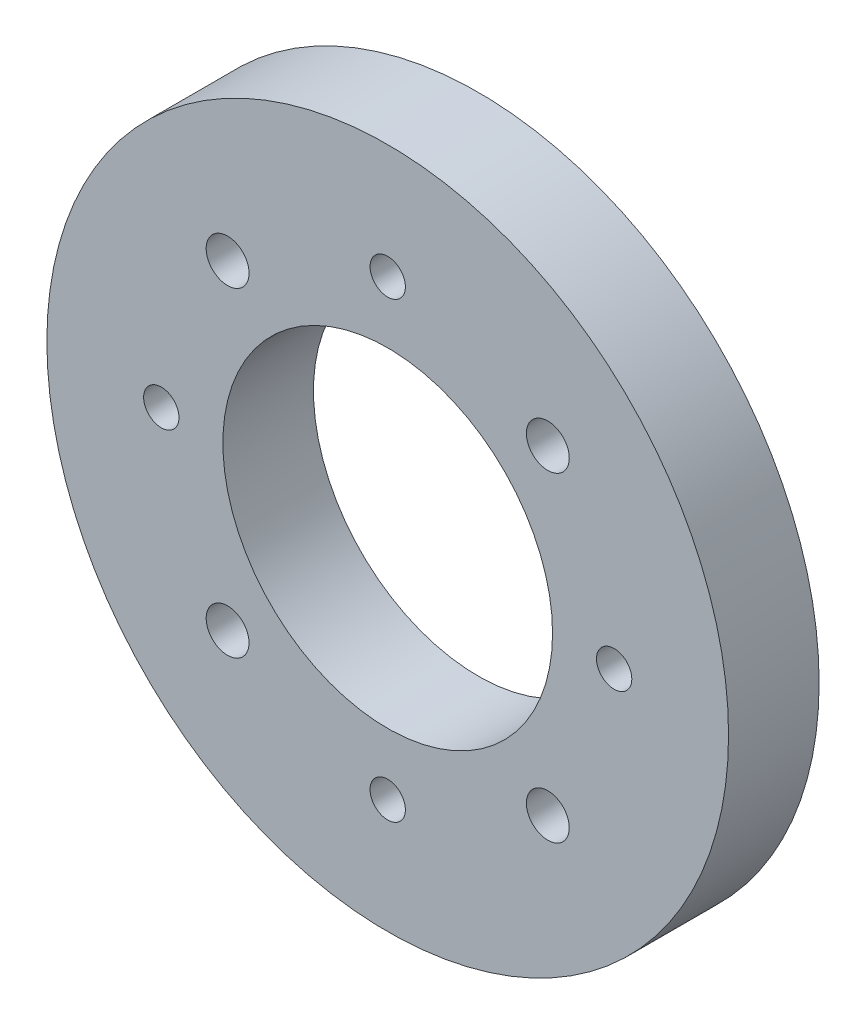
ISO-10303-21;
HEADER;
FILE_DESCRIPTION(('STEP AP214'),'2;1');
FILE_NAME('part.step','',(''),(''),'','','');
FILE_SCHEMA(('AUTOMOTIVE_DESIGN { 1 0 10303 214 1 1 1 1 }'));
ENDSEC;
DATA;
#1=APPLICATION_CONTEXT('core data for automotive mechanical design processes');
#2=APPLICATION_PROTOCOL_DEFINITION('international standard','automotive_design',2000,#1);
#3=PRODUCT_CONTEXT('',#1,'mechanical');
#4=PRODUCT('Part','Part','',(#3));
#5=PRODUCT_RELATED_PRODUCT_CATEGORY('part','',(#4));
#6=PRODUCT_DEFINITION_FORMATION('','',#4);
#7=PRODUCT_DEFINITION_CONTEXT('part definition',#1,'design');
#8=PRODUCT_DEFINITION('design','',#6,#7);
#9=PRODUCT_DEFINITION_SHAPE('','',#8);
#10=(LENGTH_UNIT() NAMED_UNIT(*) SI_UNIT(.MILLI.,.METRE.));
#11=(NAMED_UNIT(*) PLANE_ANGLE_UNIT() SI_UNIT($,.RADIAN.));
#12=(NAMED_UNIT(*) SI_UNIT($,.STERADIAN.) SOLID_ANGLE_UNIT());
#13=UNCERTAINTY_MEASURE_WITH_UNIT(LENGTH_MEASURE(1.E-05),#10,'distance_accuracy_value','');
#14=(GEOMETRIC_REPRESENTATION_CONTEXT(3) GLOBAL_UNCERTAINTY_ASSIGNED_CONTEXT((#13)) GLOBAL_UNIT_ASSIGNED_CONTEXT((#10,
#11,#12)) REPRESENTATION_CONTEXT('',''));
#15=CARTESIAN_POINT('',(0.,0.,0.));
#16=DIRECTION('',(0.,0.,1.));
#17=DIRECTION('',(1.,0.,0.));
#18=AXIS2_PLACEMENT_3D('',#15,#16,#17);
#19=CARTESIAN_POINT('',(0.,0.,6.));
#20=DIRECTION('',(0.,0.,1.));
#21=DIRECTION('',(1.,0.,0.));
#22=AXIS2_PLACEMENT_3D('',#19,#20,#21);
#23=PLANE('',#22);
#24=CARTESIAN_POINT('',(-15.,1.57116660247941E-13,6.));
#25=DIRECTION('',(0.,0.,1.));
#26=DIRECTION('',(1.,0.,0.));
#27=AXIS2_PLACEMENT_3D('',#24,#25,#26);
#28=CIRCLE('',#27,1.17);
#29=CARTESIAN_POINT('',(-13.83,1.57116660247941E-13,6.));
#30=VERTEX_POINT('',#29);
#31=EDGE_CURVE('E79',#30,#30,#28,.T.);
#32=ORIENTED_EDGE('',*,*,#31,.F.);
#33=EDGE_LOOP('',(#32));
#34=FACE_BOUND('',#33,.T.);
#35=CARTESIAN_POINT('',(3.48781665394082E-13,-15.0000000000002,6.));
#36=DIRECTION('',(0.,0.,1.));
#37=DIRECTION('',(1.,0.,0.));
#38=AXIS2_PLACEMENT_3D('',#35,#36,#37);
#39=CIRCLE('',#38,1.17);
#40=CARTESIAN_POINT('',(1.17000000000035,-15.0000000000002,6.));
#41=VERTEX_POINT('',#40);
#42=EDGE_CURVE('E67',#41,#41,#39,.T.);
#43=ORIENTED_EDGE('',*,*,#42,.F.);
#44=EDGE_LOOP('',(#43));
#45=FACE_BOUND('',#44,.T.);
#46=CARTESIAN_POINT('',(15.,0.,6.));
#47=DIRECTION('',(0.,0.,1.));
#48=DIRECTION('',(1.,0.,0.));
#49=AXIS2_PLACEMENT_3D('',#46,#47,#48);
#50=CIRCLE('',#49,1.17);
#51=CARTESIAN_POINT('',(16.17,0.,6.));
#52=VERTEX_POINT('',#51);
#53=EDGE_CURVE('E55',#52,#52,#50,.T.);
#54=ORIENTED_EDGE('',*,*,#53,.F.);
#55=EDGE_LOOP('',(#54));
#56=FACE_BOUND('',#55,.T.);
#57=CARTESIAN_POINT('',(0.,15.,6.));
#58=DIRECTION('',(0.,0.,1.));
#59=DIRECTION('',(1.,0.,0.));
#60=AXIS2_PLACEMENT_3D('',#57,#58,#59);
#61=CIRCLE('',#60,1.17);
#62=CARTESIAN_POINT('',(1.17,15.,6.));
#63=VERTEX_POINT('',#62);
#64=EDGE_CURVE('E47',#63,#63,#61,.T.);
#65=ORIENTED_EDGE('',*,*,#64,.F.);
#66=EDGE_LOOP('',(#65));
#67=FACE_BOUND('',#66,.T.);
#68=CARTESIAN_POINT('',(0.,0.,6.));
#69=DIRECTION('',(0.,0.,1.));
#70=DIRECTION('',(1.,0.,0.));
#71=AXIS2_PLACEMENT_3D('',#68,#69,#70);
#72=CIRCLE('',#71,22.58);
#73=CARTESIAN_POINT('',(22.58,0.,6.));
#74=VERTEX_POINT('',#73);
#75=EDGE_CURVE('E11',#74,#74,#72,.T.);
#76=ORIENTED_EDGE('',*,*,#75,.T.);
#77=EDGE_LOOP('',(#76));
#78=FACE_BOUND('',#77,.T.);
#79=CARTESIAN_POINT('',(0.,0.,6.));
#80=DIRECTION('',(0.,0.,1.));
#81=DIRECTION('',(1.,0.,0.));
#82=AXIS2_PLACEMENT_3D('',#79,#80,#81);
#83=CIRCLE('',#82,10.92);
#84=CARTESIAN_POINT('',(10.92,0.,6.));
#85=VERTEX_POINT('',#84);
#86=EDGE_CURVE('E42',#85,#85,#83,.T.);
#87=ORIENTED_EDGE('',*,*,#86,.F.);
#88=EDGE_LOOP('',(#87));
#89=FACE_BOUND('',#88,.T.);
#90=CARTESIAN_POINT('',(10.6066017177982,10.6066017177982,6.));
#91=DIRECTION('',(0.,0.,1.));
#92=DIRECTION('',(1.,0.,0.));
#93=AXIS2_PLACEMENT_3D('',#90,#91,#92);
#94=CIRCLE('',#93,1.42);
#95=CARTESIAN_POINT('',(12.0266017177982,10.6066017177982,6.));
#96=VERTEX_POINT('',#95);
#97=EDGE_CURVE('E48',#96,#96,#94,.T.);
#98=ORIENTED_EDGE('',*,*,#97,.F.);
#99=EDGE_LOOP('',(#98));
#100=FACE_BOUND('',#99,.T.);
#101=CARTESIAN_POINT('',(10.6066017177982,-10.6066017177983,6.));
#102=DIRECTION('',(0.,0.,1.));
#103=DIRECTION('',(1.,0.,0.));
#104=AXIS2_PLACEMENT_3D('',#101,#102,#103);
#105=CIRCLE('',#104,1.42);
#106=CARTESIAN_POINT('',(12.0266017177982,-10.6066017177983,6.));
#107=VERTEX_POINT('',#106);
#108=EDGE_CURVE('E61',#107,#107,#105,.T.);
#109=ORIENTED_EDGE('',*,*,#108,.F.);
#110=EDGE_LOOP('',(#109));
#111=FACE_BOUND('',#110,.T.);
#112=CARTESIAN_POINT('',(-10.6066017177979,-10.6066017177983,6.));
#113=DIRECTION('',(0.,0.,1.));
#114=DIRECTION('',(1.,0.,0.));
#115=AXIS2_PLACEMENT_3D('',#112,#113,#114);
#116=CIRCLE('',#115,1.42);
#117=CARTESIAN_POINT('',(-9.18660171779788,-10.6066017177983,6.));
#118=VERTEX_POINT('',#117);
#119=EDGE_CURVE('E73',#118,#118,#116,.T.);
#120=ORIENTED_EDGE('',*,*,#119,.F.);
#121=EDGE_LOOP('',(#120));
#122=FACE_BOUND('',#121,.T.);
#123=CARTESIAN_POINT('',(-10.6066017177981,10.6066017177983,6.));
#124=DIRECTION('',(0.,0.,1.));
#125=DIRECTION('',(1.,0.,0.));
#126=AXIS2_PLACEMENT_3D('',#123,#124,#125);
#127=CIRCLE('',#126,1.42);
#128=CARTESIAN_POINT('',(-9.18660171779808,10.6066017177983,6.));
#129=VERTEX_POINT('',#128);
#130=EDGE_CURVE('E85',#129,#129,#127,.T.);
#131=ORIENTED_EDGE('',*,*,#130,.F.);
#132=EDGE_LOOP('',(#131));
#133=FACE_BOUND('',#132,.T.);
#134=ADVANCED_FACE('F31',(#34,#45,#56,#67,#78,#89,#100,#111,#122,#133),#23,.T.);
#135=CARTESIAN_POINT('',(0.,0.,0.));
#136=DIRECTION('',(0.,0.,1.));
#137=DIRECTION('',(1.,0.,0.));
#138=AXIS2_PLACEMENT_3D('',#135,#136,#137);
#139=PLANE('',#138);
#140=CARTESIAN_POINT('',(-15.,1.57116660247941E-13,0.));
#141=DIRECTION('',(0.,0.,1.));
#142=DIRECTION('',(1.,0.,0.));
#143=AXIS2_PLACEMENT_3D('',#140,#141,#142);
#144=CIRCLE('',#143,1.17);
#145=CARTESIAN_POINT('',(-13.83,1.57116660247941E-13,0.));
#146=VERTEX_POINT('',#145);
#147=EDGE_CURVE('E82',#146,#146,#144,.T.);
#148=ORIENTED_EDGE('',*,*,#147,.T.);
#149=EDGE_LOOP('',(#148));
#150=FACE_BOUND('',#149,.T.);
#151=CARTESIAN_POINT('',(3.48781665394082E-13,-15.0000000000002,0.));
#152=DIRECTION('',(0.,0.,1.));
#153=DIRECTION('',(1.,0.,0.));
#154=AXIS2_PLACEMENT_3D('',#151,#152,#153);
#155=CIRCLE('',#154,1.17);
#156=CARTESIAN_POINT('',(1.17000000000035,-15.0000000000002,0.));
#157=VERTEX_POINT('',#156);
#158=EDGE_CURVE('E70',#157,#157,#155,.T.);
#159=ORIENTED_EDGE('',*,*,#158,.T.);
#160=EDGE_LOOP('',(#159));
#161=FACE_BOUND('',#160,.T.);
#162=CARTESIAN_POINT('',(15.,0.,0.));
#163=DIRECTION('',(0.,0.,1.));
#164=DIRECTION('',(1.,0.,0.));
#165=AXIS2_PLACEMENT_3D('',#162,#163,#164);
#166=CIRCLE('',#165,1.17);
#167=CARTESIAN_POINT('',(16.17,0.,0.));
#168=VERTEX_POINT('',#167);
#169=EDGE_CURVE('E58',#168,#168,#166,.T.);
#170=ORIENTED_EDGE('',*,*,#169,.T.);
#171=EDGE_LOOP('',(#170));
#172=FACE_BOUND('',#171,.T.);
#173=CARTESIAN_POINT('',(0.,15.,0.));
#174=DIRECTION('',(0.,0.,1.));
#175=DIRECTION('',(1.,0.,0.));
#176=AXIS2_PLACEMENT_3D('',#173,#174,#175);
#177=CIRCLE('',#176,1.17);
#178=CARTESIAN_POINT('',(1.17,15.,0.));
#179=VERTEX_POINT('',#178);
#180=EDGE_CURVE('E44',#179,#179,#177,.T.);
#181=ORIENTED_EDGE('',*,*,#180,.T.);
#182=EDGE_LOOP('',(#181));
#183=FACE_BOUND('',#182,.T.);
#184=CARTESIAN_POINT('',(0.,0.,0.));
#185=DIRECTION('',(0.,0.,1.));
#186=DIRECTION('',(1.,0.,0.));
#187=AXIS2_PLACEMENT_3D('',#184,#185,#186);
#188=CIRCLE('',#187,22.58);
#189=CARTESIAN_POINT('',(22.58,0.,0.));
#190=VERTEX_POINT('',#189);
#191=EDGE_CURVE('E35',#190,#190,#188,.T.);
#192=ORIENTED_EDGE('',*,*,#191,.F.);
#193=EDGE_LOOP('',(#192));
#194=FACE_BOUND('',#193,.T.);
#195=CARTESIAN_POINT('',(0.,0.,0.));
#196=DIRECTION('',(0.,0.,1.));
#197=DIRECTION('',(1.,0.,0.));
#198=AXIS2_PLACEMENT_3D('',#195,#196,#197);
#199=CIRCLE('',#198,10.92);
#200=CARTESIAN_POINT('',(10.92,0.,0.));
#201=VERTEX_POINT('',#200);
#202=EDGE_CURVE('E51',#201,#201,#199,.T.);
#203=ORIENTED_EDGE('',*,*,#202,.T.);
#204=EDGE_LOOP('',(#203));
#205=FACE_BOUND('',#204,.T.);
#206=CARTESIAN_POINT('',(10.6066017177982,10.6066017177982,0.));
#207=DIRECTION('',(0.,0.,1.));
#208=DIRECTION('',(1.,0.,0.));
#209=AXIS2_PLACEMENT_3D('',#206,#207,#208);
#210=CIRCLE('',#209,1.42);
#211=CARTESIAN_POINT('',(12.0266017177982,10.6066017177982,0.));
#212=VERTEX_POINT('',#211);
#213=EDGE_CURVE('E52',#212,#212,#210,.T.);
#214=ORIENTED_EDGE('',*,*,#213,.T.);
#215=EDGE_LOOP('',(#214));
#216=FACE_BOUND('',#215,.T.);
#217=CARTESIAN_POINT('',(10.6066017177982,-10.6066017177983,0.));
#218=DIRECTION('',(0.,0.,1.));
#219=DIRECTION('',(1.,0.,0.));
#220=AXIS2_PLACEMENT_3D('',#217,#218,#219);
#221=CIRCLE('',#220,1.42);
#222=CARTESIAN_POINT('',(12.0266017177982,-10.6066017177983,0.));
#223=VERTEX_POINT('',#222);
#224=EDGE_CURVE('E64',#223,#223,#221,.T.);
#225=ORIENTED_EDGE('',*,*,#224,.T.);
#226=EDGE_LOOP('',(#225));
#227=FACE_BOUND('',#226,.T.);
#228=CARTESIAN_POINT('',(-10.6066017177979,-10.6066017177983,0.));
#229=DIRECTION('',(0.,0.,1.));
#230=DIRECTION('',(1.,0.,0.));
#231=AXIS2_PLACEMENT_3D('',#228,#229,#230);
#232=CIRCLE('',#231,1.42);
#233=CARTESIAN_POINT('',(-9.18660171779788,-10.6066017177983,0.));
#234=VERTEX_POINT('',#233);
#235=EDGE_CURVE('E76',#234,#234,#232,.T.);
#236=ORIENTED_EDGE('',*,*,#235,.T.);
#237=EDGE_LOOP('',(#236));
#238=FACE_BOUND('',#237,.T.);
#239=CARTESIAN_POINT('',(-10.6066017177981,10.6066017177983,0.));
#240=DIRECTION('',(0.,0.,1.));
#241=DIRECTION('',(1.,0.,0.));
#242=AXIS2_PLACEMENT_3D('',#239,#240,#241);
#243=CIRCLE('',#242,1.42);
#244=CARTESIAN_POINT('',(-9.18660171779808,10.6066017177983,0.));
#245=VERTEX_POINT('',#244);
#246=EDGE_CURVE('E88',#245,#245,#243,.T.);
#247=ORIENTED_EDGE('',*,*,#246,.T.);
#248=EDGE_LOOP('',(#247));
#249=FACE_BOUND('',#248,.T.);
#250=ADVANCED_FACE('F103',(#150,#161,#172,#183,#194,#205,#216,#227,#238,#249),#139,.F.);
#251=CARTESIAN_POINT('',(0.,0.,6.));
#252=DIRECTION('',(0.,0.,-1.));
#253=DIRECTION('',(-1.,0.,0.));
#254=AXIS2_PLACEMENT_3D('',#251,#252,#253);
#255=CYLINDRICAL_SURFACE('',#254,22.58);
#256=ORIENTED_EDGE('',*,*,#75,.F.);
#257=EDGE_LOOP('',(#256));
#258=FACE_BOUND('',#257,.T.);
#259=ORIENTED_EDGE('',*,*,#191,.T.);
#260=EDGE_LOOP('',(#259));
#261=FACE_BOUND('',#260,.T.);
#262=ADVANCED_FACE('F120',(#258,#261),#255,.T.);
#263=CARTESIAN_POINT('',(0.,0.,6.));
#264=DIRECTION('',(0.,0.,-1.));
#265=DIRECTION('',(-1.,0.,0.));
#266=AXIS2_PLACEMENT_3D('',#263,#264,#265);
#267=CYLINDRICAL_SURFACE('',#266,10.92);
#268=ORIENTED_EDGE('',*,*,#86,.T.);
#269=EDGE_LOOP('',(#268));
#270=FACE_BOUND('',#269,.T.);
#271=ORIENTED_EDGE('',*,*,#202,.F.);
#272=EDGE_LOOP('',(#271));
#273=FACE_BOUND('',#272,.T.);
#274=ADVANCED_FACE('F98',(#270,#273),#267,.F.);
#275=CARTESIAN_POINT('',(0.,15.,6.));
#276=DIRECTION('',(0.,0.,-1.));
#277=DIRECTION('',(-1.,0.,0.));
#278=AXIS2_PLACEMENT_3D('',#275,#276,#277);
#279=CYLINDRICAL_SURFACE('',#278,1.17);
#280=ORIENTED_EDGE('',*,*,#64,.T.);
#281=EDGE_LOOP('',(#280));
#282=FACE_BOUND('',#281,.T.);
#283=ORIENTED_EDGE('',*,*,#180,.F.);
#284=EDGE_LOOP('',(#283));
#285=FACE_BOUND('',#284,.T.);
#286=ADVANCED_FACE('F131',(#282,#285),#279,.F.);
#287=CARTESIAN_POINT('',(10.6066017177982,10.6066017177982,6.));
#288=DIRECTION('',(0.,0.,-1.));
#289=DIRECTION('',(-1.,0.,0.));
#290=AXIS2_PLACEMENT_3D('',#287,#288,#289);
#291=CYLINDRICAL_SURFACE('',#290,1.42);
#292=ORIENTED_EDGE('',*,*,#97,.T.);
#293=EDGE_LOOP('',(#292));
#294=FACE_BOUND('',#293,.T.);
#295=ORIENTED_EDGE('',*,*,#213,.F.);
#296=EDGE_LOOP('',(#295));
#297=FACE_BOUND('',#296,.T.);
#298=ADVANCED_FACE('F135',(#294,#297),#291,.F.);
#299=CARTESIAN_POINT('',(15.,0.,6.));
#300=DIRECTION('',(0.,0.,-1.));
#301=DIRECTION('',(-1.,0.,0.));
#302=AXIS2_PLACEMENT_3D('',#299,#300,#301);
#303=CYLINDRICAL_SURFACE('',#302,1.17);
#304=ORIENTED_EDGE('',*,*,#53,.T.);
#305=EDGE_LOOP('',(#304));
#306=FACE_BOUND('',#305,.T.);
#307=ORIENTED_EDGE('',*,*,#169,.F.);
#308=EDGE_LOOP('',(#307));
#309=FACE_BOUND('',#308,.T.);
#310=ADVANCED_FACE('F139',(#306,#309),#303,.F.);
#311=CARTESIAN_POINT('',(10.6066017177982,-10.6066017177983,6.));
#312=DIRECTION('',(0.,0.,-1.));
#313=DIRECTION('',(-1.,0.,0.));
#314=AXIS2_PLACEMENT_3D('',#311,#312,#313);
#315=CYLINDRICAL_SURFACE('',#314,1.42);
#316=ORIENTED_EDGE('',*,*,#108,.T.);
#317=EDGE_LOOP('',(#316));
#318=FACE_BOUND('',#317,.T.);
#319=ORIENTED_EDGE('',*,*,#224,.F.);
#320=EDGE_LOOP('',(#319));
#321=FACE_BOUND('',#320,.T.);
#322=ADVANCED_FACE('F143',(#318,#321),#315,.F.);
#323=CARTESIAN_POINT('',(3.48781665394082E-13,-15.0000000000002,6.));
#324=DIRECTION('',(0.,0.,-1.));
#325=DIRECTION('',(-1.,0.,0.));
#326=AXIS2_PLACEMENT_3D('',#323,#324,#325);
#327=CYLINDRICAL_SURFACE('',#326,1.17);
#328=ORIENTED_EDGE('',*,*,#42,.T.);
#329=EDGE_LOOP('',(#328));
#330=FACE_BOUND('',#329,.T.);
#331=ORIENTED_EDGE('',*,*,#158,.F.);
#332=EDGE_LOOP('',(#331));
#333=FACE_BOUND('',#332,.T.);
#334=ADVANCED_FACE('F147',(#330,#333),#327,.F.);
#335=CARTESIAN_POINT('',(-10.6066017177979,-10.6066017177983,6.));
#336=DIRECTION('',(0.,0.,-1.));
#337=DIRECTION('',(-1.,0.,0.));
#338=AXIS2_PLACEMENT_3D('',#335,#336,#337);
#339=CYLINDRICAL_SURFACE('',#338,1.42);
#340=ORIENTED_EDGE('',*,*,#119,.T.);
#341=EDGE_LOOP('',(#340));
#342=FACE_BOUND('',#341,.T.);
#343=ORIENTED_EDGE('',*,*,#235,.F.);
#344=EDGE_LOOP('',(#343));
#345=FACE_BOUND('',#344,.T.);
#346=ADVANCED_FACE('F151',(#342,#345),#339,.F.);
#347=CARTESIAN_POINT('',(-15.,1.57116660247941E-13,6.));
#348=DIRECTION('',(0.,0.,-1.));
#349=DIRECTION('',(-1.,0.,0.));
#350=AXIS2_PLACEMENT_3D('',#347,#348,#349);
#351=CYLINDRICAL_SURFACE('',#350,1.17);
#352=ORIENTED_EDGE('',*,*,#31,.T.);
#353=EDGE_LOOP('',(#352));
#354=FACE_BOUND('',#353,.T.);
#355=ORIENTED_EDGE('',*,*,#147,.F.);
#356=EDGE_LOOP('',(#355));
#357=FACE_BOUND('',#356,.T.);
#358=ADVANCED_FACE('F116',(#354,#357),#351,.F.);
#359=CARTESIAN_POINT('',(-10.6066017177981,10.6066017177983,6.));
#360=DIRECTION('',(0.,0.,-1.));
#361=DIRECTION('',(-1.,0.,0.));
#362=AXIS2_PLACEMENT_3D('',#359,#360,#361);
#363=CYLINDRICAL_SURFACE('',#362,1.42);
#364=ORIENTED_EDGE('',*,*,#130,.T.);
#365=EDGE_LOOP('',(#364));
#366=FACE_BOUND('',#365,.T.);
#367=ORIENTED_EDGE('',*,*,#246,.F.);
#368=EDGE_LOOP('',(#367));
#369=FACE_BOUND('',#368,.T.);
#370=ADVANCED_FACE('F33',(#366,#369),#363,.F.);
#371=CLOSED_SHELL('',(#134,#250,#262,#274,#286,#298,#310,#322,#334,#346,#358,#370));
#372=MANIFOLD_SOLID_BREP('B2',#371);
#373=ADVANCED_BREP_SHAPE_REPRESENTATION('',(#18,#372),#14);
#374=SHAPE_DEFINITION_REPRESENTATION(#9,#373);
ENDSEC;
END-ISO-10303-21;
